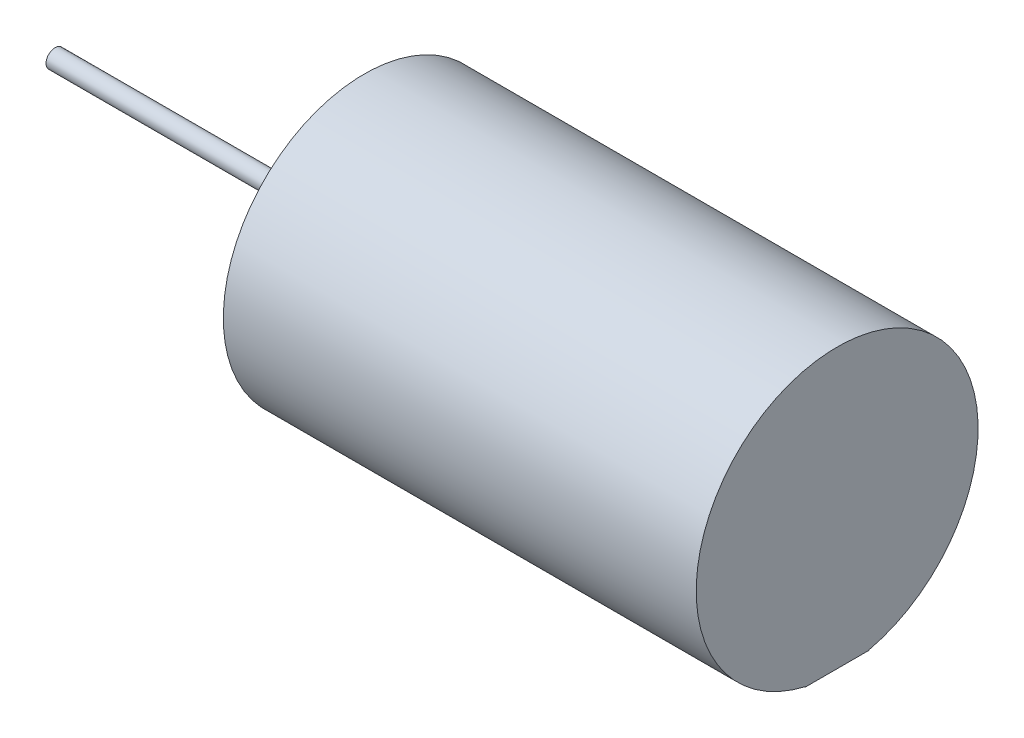
ISO-10303-21;
HEADER;
FILE_DESCRIPTION(('STEP AP214'),'2;1');
FILE_NAME('part.step','',(''),(''),'','','');
FILE_SCHEMA(('AUTOMOTIVE_DESIGN { 1 0 10303 214 1 1 1 1 }'));
ENDSEC;
DATA;
#1=APPLICATION_CONTEXT('core data for automotive mechanical design processes');
#2=APPLICATION_PROTOCOL_DEFINITION('international standard','automotive_design',2000,#1);
#3=PRODUCT_CONTEXT('',#1,'mechanical');
#4=PRODUCT('Part','Part','',(#3));
#5=PRODUCT_RELATED_PRODUCT_CATEGORY('part','',(#4));
#6=PRODUCT_DEFINITION_FORMATION('','',#4);
#7=PRODUCT_DEFINITION_CONTEXT('part definition',#1,'design');
#8=PRODUCT_DEFINITION('design','',#6,#7);
#9=PRODUCT_DEFINITION_SHAPE('','',#8);
#10=(LENGTH_UNIT() NAMED_UNIT(*) SI_UNIT(.MILLI.,.METRE.));
#11=(NAMED_UNIT(*) PLANE_ANGLE_UNIT() SI_UNIT($,.RADIAN.));
#12=(NAMED_UNIT(*) SI_UNIT($,.STERADIAN.) SOLID_ANGLE_UNIT());
#13=UNCERTAINTY_MEASURE_WITH_UNIT(LENGTH_MEASURE(1.E-05),#10,'distance_accuracy_value','');
#14=(GEOMETRIC_REPRESENTATION_CONTEXT(3) GLOBAL_UNCERTAINTY_ASSIGNED_CONTEXT((#13)) GLOBAL_UNIT_ASSIGNED_CONTEXT((#10,
#11,#12)) REPRESENTATION_CONTEXT('',''));
#15=CARTESIAN_POINT('',(0.,0.,0.));
#16=DIRECTION('',(0.,0.,1.));
#17=DIRECTION('',(1.,0.,0.));
#18=AXIS2_PLACEMENT_3D('',#15,#16,#17);
#19=CARTESIAN_POINT('',(-16.,43.,-3.5));
#20=DIRECTION('',(0.,0.,1.));
#21=DIRECTION('',(1.,0.,0.));
#22=AXIS2_PLACEMENT_3D('',#19,#20,#21);
#23=PLANE('',#22);
#24=DIRECTION('',(1.,0.,0.));
#25=VECTOR('',#24,1.);
#26=CARTESIAN_POINT('',(-16.,43.3553922890013,-3.5));
#27=LINE('',#26,#25);
#28=CARTESIAN_POINT('',(-26.,43.3553922890013,-3.5));
#29=VERTEX_POINT('',#28);
#30=CARTESIAN_POINT('',(26.,43.3553922890013,-3.5));
#31=VERTEX_POINT('',#30);
#32=EDGE_CURVE('E49',#29,#31,#27,.T.);
#33=ORIENTED_EDGE('',*,*,#32,.F.);
#34=DIRECTION('',(0.,1.,0.));
#35=VECTOR('',#34,1.);
#36=CARTESIAN_POINT('',(-26.,43.,-3.5));
#37=LINE('',#36,#35);
#38=CARTESIAN_POINT('',(-26.,43.4003311294585,-3.5));
#39=VERTEX_POINT('',#38);
#40=EDGE_CURVE('E100',#29,#39,#37,.T.);
#41=ORIENTED_EDGE('',*,*,#40,.T.);
#42=DIRECTION('',(-1.,0.,0.));
#43=VECTOR('',#42,1.);
#44=CARTESIAN_POINT('',(26.,43.4003311294585,-3.5));
#45=LINE('',#44,#43);
#46=CARTESIAN_POINT('',(26.,43.4003311294585,-3.5));
#47=VERTEX_POINT('',#46);
#48=EDGE_CURVE('E102',#47,#39,#45,.T.);
#49=ORIENTED_EDGE('',*,*,#48,.F.);
#50=DIRECTION('',(0.,1.,0.));
#51=VECTOR('',#50,1.);
#52=CARTESIAN_POINT('',(26.,43.,-3.5));
#53=LINE('',#52,#51);
#54=EDGE_CURVE('E57',#31,#47,#53,.T.);
#55=ORIENTED_EDGE('',*,*,#54,.F.);
#56=EDGE_LOOP('',(#33,#41,#49,#55));
#57=FACE_BOUND('',#56,.T.);
#58=ADVANCED_FACE('F36',(#57),#23,.F.);
#59=CARTESIAN_POINT('',(19.,43.,3.5));
#60=DIRECTION('',(0.,0.,-1.));
#61=DIRECTION('',(-1.,0.,0.));
#62=AXIS2_PLACEMENT_3D('',#59,#60,#61);
#63=PLANE('',#62);
#64=DIRECTION('',(-1.,0.,0.));
#65=VECTOR('',#64,1.);
#66=CARTESIAN_POINT('',(19.,43.3553922890013,3.5));
#67=LINE('',#66,#65);
#68=CARTESIAN_POINT('',(26.,43.3553922890013,3.5));
#69=VERTEX_POINT('',#68);
#70=CARTESIAN_POINT('',(-26.,43.3553922890013,3.5));
#71=VERTEX_POINT('',#70);
#72=EDGE_CURVE('E74',#69,#71,#67,.T.);
#73=ORIENTED_EDGE('',*,*,#72,.F.);
#74=DIRECTION('',(0.,-1.,0.));
#75=VECTOR('',#74,1.);
#76=CARTESIAN_POINT('',(26.,43.,3.5));
#77=LINE('',#76,#75);
#78=CARTESIAN_POINT('',(26.,43.4003311294585,3.5));
#79=VERTEX_POINT('',#78);
#80=EDGE_CURVE('E82',#79,#69,#77,.T.);
#81=ORIENTED_EDGE('',*,*,#80,.F.);
#82=DIRECTION('',(-1.,0.,0.));
#83=VECTOR('',#82,1.);
#84=CARTESIAN_POINT('',(26.,43.4003311294585,3.5));
#85=LINE('',#84,#83);
#86=CARTESIAN_POINT('',(-26.,43.4003311294585,3.5));
#87=VERTEX_POINT('',#86);
#88=EDGE_CURVE('E90',#79,#87,#85,.T.);
#89=ORIENTED_EDGE('',*,*,#88,.T.);
#90=DIRECTION('',(0.,-1.,0.));
#91=VECTOR('',#90,1.);
#92=CARTESIAN_POINT('',(-26.,43.,3.5));
#93=LINE('',#92,#91);
#94=EDGE_CURVE('E84',#87,#71,#93,.T.);
#95=ORIENTED_EDGE('',*,*,#94,.T.);
#96=EDGE_LOOP('',(#73,#81,#89,#95));
#97=FACE_BOUND('',#96,.T.);
#98=ADVANCED_FACE('F80',(#97),#63,.F.);
#99=CARTESIAN_POINT('',(-26.,74.,20.));
#100=DIRECTION('',(1.,0.,0.));
#101=DIRECTION('',(0.,0.,-1.));
#102=AXIS2_PLACEMENT_3D('',#99,#100,#101);
#103=PLANE('',#102);
#104=CARTESIAN_POINT('',(-26.,58.5,0.));
#105=DIRECTION('',(1.,0.,0.));
#106=DIRECTION('',(0.,0.,-1.));
#107=AXIS2_PLACEMENT_3D('',#104,#105,#106);
#108=CIRCLE('',#107,5.);
#109=CARTESIAN_POINT('',(-26.,58.5,-5.));
#110=VERTEX_POINT('',#109);
#111=EDGE_CURVE('E106',#110,#110,#108,.F.);
#112=ORIENTED_EDGE('',*,*,#111,.F.);
#113=EDGE_LOOP('',(#112));
#114=FACE_BOUND('',#113,.T.);
#115=DIRECTION('',(0.,0.,-1.));
#116=VECTOR('',#115,1.);
#117=CARTESIAN_POINT('',(-26.,43.3553922890013,20.));
#118=LINE('',#117,#116);
#119=EDGE_CURVE('E117',#71,#29,#118,.T.);
#120=ORIENTED_EDGE('',*,*,#119,.F.);
#121=ORIENTED_EDGE('',*,*,#94,.F.);
#122=CARTESIAN_POINT('',(-26.,58.5,0.));
#123=DIRECTION('',(1.,0.,0.));
#124=DIRECTION('',(0.,0.,1.));
#125=AXIS2_PLACEMENT_3D('',#122,#123,#124);
#126=CIRCLE('',#125,15.5);
#127=EDGE_CURVE('E92',#39,#87,#126,.T.);
#128=ORIENTED_EDGE('',*,*,#127,.F.);
#129=ORIENTED_EDGE('',*,*,#40,.F.);
#130=EDGE_LOOP('',(#120,#121,#128,#129));
#131=FACE_BOUND('',#130,.T.);
#132=ADVANCED_FACE('F123',(#114,#131),#103,.F.);
#133=CARTESIAN_POINT('',(26.,74.,20.));
#134=DIRECTION('',(-1.,0.,0.));
#135=DIRECTION('',(0.,0.,1.));
#136=AXIS2_PLACEMENT_3D('',#133,#134,#135);
#137=PLANE('',#136);
#138=DIRECTION('',(0.,0.,1.));
#139=VECTOR('',#138,1.);
#140=CARTESIAN_POINT('',(26.,43.3553922890013,20.));
#141=LINE('',#140,#139);
#142=EDGE_CURVE('E11',#31,#69,#141,.T.);
#143=ORIENTED_EDGE('',*,*,#142,.F.);
#144=ORIENTED_EDGE('',*,*,#54,.T.);
#145=CARTESIAN_POINT('',(26.,58.5,0.));
#146=DIRECTION('',(1.,0.,0.));
#147=DIRECTION('',(0.,0.,1.));
#148=AXIS2_PLACEMENT_3D('',#145,#146,#147);
#149=CIRCLE('',#148,15.5);
#150=EDGE_CURVE('E88',#47,#79,#149,.T.);
#151=ORIENTED_EDGE('',*,*,#150,.T.);
#152=ORIENTED_EDGE('',*,*,#80,.T.);
#153=EDGE_LOOP('',(#143,#144,#151,#152));
#154=FACE_BOUND('',#153,.T.);
#155=ADVANCED_FACE('F86',(#154),#137,.F.);
#156=CARTESIAN_POINT('',(26.,58.5,0.));
#157=DIRECTION('',(-1.,0.,0.));
#158=DIRECTION('',(0.,0.,1.));
#159=AXIS2_PLACEMENT_3D('',#156,#157,#158);
#160=CYLINDRICAL_SURFACE('',#159,15.5);
#161=ORIENTED_EDGE('',*,*,#127,.T.);
#162=ORIENTED_EDGE('',*,*,#88,.F.);
#163=ORIENTED_EDGE('',*,*,#150,.F.);
#164=ORIENTED_EDGE('',*,*,#48,.T.);
#165=EDGE_LOOP('',(#161,#162,#163,#164));
#166=FACE_BOUND('',#165,.T.);
#167=ADVANCED_FACE('F125',(#166),#160,.T.);
#168=CARTESIAN_POINT('',(-29.,58.5,0.));
#169=DIRECTION('',(1.,0.,0.));
#170=DIRECTION('',(0.,0.,-1.));
#171=AXIS2_PLACEMENT_3D('',#168,#169,#170);
#172=CYLINDRICAL_SURFACE('',#171,5.);
#173=CARTESIAN_POINT('',(-29.,58.5,0.));
#174=DIRECTION('',(-1.,0.,0.));
#175=DIRECTION('',(0.,0.,1.));
#176=AXIS2_PLACEMENT_3D('',#173,#174,#175);
#177=CIRCLE('',#176,5.);
#178=CARTESIAN_POINT('',(-29.,58.5,5.));
#179=VERTEX_POINT('',#178);
#180=EDGE_CURVE('E94',#179,#179,#177,.T.);
#181=ORIENTED_EDGE('',*,*,#180,.F.);
#182=EDGE_LOOP('',(#181));
#183=FACE_BOUND('',#182,.T.);
#184=ORIENTED_EDGE('',*,*,#111,.T.);
#185=EDGE_LOOP('',(#184));
#186=FACE_BOUND('',#185,.T.);
#187=ADVANCED_FACE('F127',(#183,#186),#172,.T.);
#188=CARTESIAN_POINT('',(-29.,58.5,0.));
#189=DIRECTION('',(-1.,0.,0.));
#190=DIRECTION('',(0.,0.,1.));
#191=AXIS2_PLACEMENT_3D('',#188,#189,#190);
#192=PLANE('',#191);
#193=CARTESIAN_POINT('',(-29.,58.5,0.));
#194=DIRECTION('',(-1.,0.,0.));
#195=DIRECTION('',(0.,0.,1.));
#196=AXIS2_PLACEMENT_3D('',#193,#194,#195);
#197=CIRCLE('',#196,1.);
#198=CARTESIAN_POINT('',(-29.,58.5,1.));
#199=VERTEX_POINT('',#198);
#200=EDGE_CURVE('E43',#199,#199,#197,.T.);
#201=ORIENTED_EDGE('',*,*,#200,.F.);
#202=EDGE_LOOP('',(#201));
#203=FACE_BOUND('',#202,.T.);
#204=ORIENTED_EDGE('',*,*,#180,.T.);
#205=EDGE_LOOP('',(#204));
#206=FACE_BOUND('',#205,.T.);
#207=ADVANCED_FACE('F133',(#203,#206),#192,.T.);
#208=CARTESIAN_POINT('',(-60.,58.5,0.));
#209=DIRECTION('',(1.,0.,0.));
#210=DIRECTION('',(0.,0.,-1.));
#211=AXIS2_PLACEMENT_3D('',#208,#209,#210);
#212=CYLINDRICAL_SURFACE('',#211,1.);
#213=CARTESIAN_POINT('',(-60.,58.5,0.));
#214=DIRECTION('',(-1.,0.,0.));
#215=DIRECTION('',(0.,0.,1.));
#216=AXIS2_PLACEMENT_3D('',#213,#214,#215);
#217=CIRCLE('',#216,1.);
#218=CARTESIAN_POINT('',(-60.,58.5,1.));
#219=VERTEX_POINT('',#218);
#220=EDGE_CURVE('E114',#219,#219,#217,.T.);
#221=ORIENTED_EDGE('',*,*,#220,.F.);
#222=EDGE_LOOP('',(#221));
#223=FACE_BOUND('',#222,.T.);
#224=ORIENTED_EDGE('',*,*,#200,.T.);
#225=EDGE_LOOP('',(#224));
#226=FACE_BOUND('',#225,.T.);
#227=ADVANCED_FACE('F171',(#223,#226),#212,.T.);
#228=CARTESIAN_POINT('',(-60.,58.5,0.));
#229=DIRECTION('',(-1.,0.,0.));
#230=DIRECTION('',(0.,0.,1.));
#231=AXIS2_PLACEMENT_3D('',#228,#229,#230);
#232=PLANE('',#231);
#233=ORIENTED_EDGE('',*,*,#220,.T.);
#234=EDGE_LOOP('',(#233));
#235=FACE_BOUND('',#234,.T.);
#236=ADVANCED_FACE('F161',(#235),#232,.T.);
#237=CARTESIAN_POINT('',(-40.0000000000002,43.3553922890013,21.1836167367409));
#238=DIRECTION('',(0.,-1.,0.));
#239=DIRECTION('',(0.,0.,-1.));
#240=AXIS2_PLACEMENT_3D('',#237,#238,#239);
#241=PLANE('',#240);
#242=ORIENTED_EDGE('',*,*,#119,.T.);
#243=ORIENTED_EDGE('',*,*,#32,.T.);
#244=ORIENTED_EDGE('',*,*,#142,.T.);
#245=ORIENTED_EDGE('',*,*,#72,.T.);
#246=EDGE_LOOP('',(#242,#243,#244,#245));
#247=FACE_BOUND('',#246,.T.);
#248=ADVANCED_FACE('F73',(#247),#241,.T.);
#249=CLOSED_SHELL('',(#58,#98,#132,#155,#167,#187,#207,#227,#236,#248));
#250=MANIFOLD_SOLID_BREP('B2',#249);
#251=ADVANCED_BREP_SHAPE_REPRESENTATION('',(#18,#250),#14);
#252=SHAPE_DEFINITION_REPRESENTATION(#9,#251);
ENDSEC;
END-ISO-10303-21;
